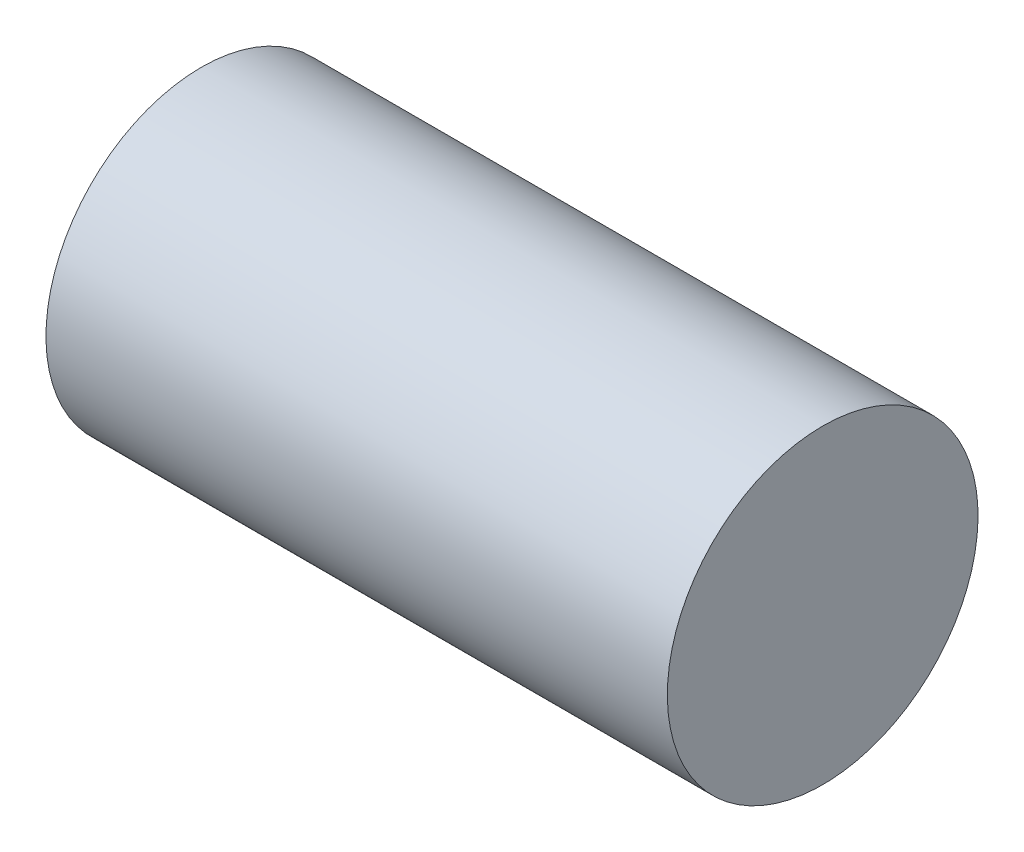
ISO-10303-21;
HEADER;
FILE_DESCRIPTION(('STEP AP214'),'2;1');
FILE_NAME('part.step','',(''),(''),'','','');
FILE_SCHEMA(('AUTOMOTIVE_DESIGN { 1 0 10303 214 1 1 1 1 }'));
ENDSEC;
DATA;
#1=APPLICATION_CONTEXT('core data for automotive mechanical design processes');
#2=APPLICATION_PROTOCOL_DEFINITION('international standard','automotive_design',2000,#1);
#3=PRODUCT_CONTEXT('',#1,'mechanical');
#4=PRODUCT('Part','Part','',(#3));
#5=PRODUCT_RELATED_PRODUCT_CATEGORY('part','',(#4));
#6=PRODUCT_DEFINITION_FORMATION('','',#4);
#7=PRODUCT_DEFINITION_CONTEXT('part definition',#1,'design');
#8=PRODUCT_DEFINITION('design','',#6,#7);
#9=PRODUCT_DEFINITION_SHAPE('','',#8);
#10=(LENGTH_UNIT() NAMED_UNIT(*) SI_UNIT(.MILLI.,.METRE.));
#11=(NAMED_UNIT(*) PLANE_ANGLE_UNIT() SI_UNIT($,.RADIAN.));
#12=(NAMED_UNIT(*) SI_UNIT($,.STERADIAN.) SOLID_ANGLE_UNIT());
#13=UNCERTAINTY_MEASURE_WITH_UNIT(LENGTH_MEASURE(1.E-05),#10,'distance_accuracy_value','');
#14=(GEOMETRIC_REPRESENTATION_CONTEXT(3) GLOBAL_UNCERTAINTY_ASSIGNED_CONTEXT((#13)) GLOBAL_UNIT_ASSIGNED_CONTEXT((#10,
#11,#12)) REPRESENTATION_CONTEXT('',''));
#15=CARTESIAN_POINT('',(0.,0.,0.));
#16=DIRECTION('',(0.,0.,1.));
#17=DIRECTION('',(1.,0.,0.));
#18=AXIS2_PLACEMENT_3D('',#15,#16,#17);
#19=CARTESIAN_POINT('',(0.,0.,0.));
#20=DIRECTION('',(1.,0.,0.));
#21=DIRECTION('',(0.,1.,0.));
#22=AXIS2_PLACEMENT_3D('',#19,#20,#21);
#23=PLANE('',#22);
#24=CARTESIAN_POINT('',(0.,0.,0.));
#25=DIRECTION('',(1.,0.,0.));
#26=DIRECTION('',(0.,1.,0.));
#27=AXIS2_PLACEMENT_3D('',#24,#25,#26);
#28=CIRCLE('',#27,1.);
#29=CARTESIAN_POINT('',(0.,1.,0.));
#30=VERTEX_POINT('',#29);
#31=EDGE_CURVE('E10',#30,#30,#28,.T.);
#32=ORIENTED_EDGE('',*,*,#31,.T.);
#33=EDGE_LOOP('',(#32));
#34=FACE_BOUND('',#33,.T.);
#35=ADVANCED_FACE('F35',(#34),#23,.T.);
#36=CARTESIAN_POINT('',(0.,0.,0.));
#37=DIRECTION('',(1.,0.,0.));
#38=DIRECTION('',(0.,1.,0.));
#39=AXIS2_PLACEMENT_3D('',#36,#37,#38);
#40=CYLINDRICAL_SURFACE('',#39,1.);
#41=CARTESIAN_POINT('',(-4.,0.,0.));
#42=DIRECTION('',(1.,0.,0.));
#43=DIRECTION('',(0.,1.,0.));
#44=AXIS2_PLACEMENT_3D('',#41,#42,#43);
#45=CIRCLE('',#44,1.);
#46=CARTESIAN_POINT('',(-4.,1.,0.));
#47=VERTEX_POINT('',#46);
#48=EDGE_CURVE('E41',#47,#47,#45,.T.);
#49=ORIENTED_EDGE('',*,*,#48,.T.);
#50=EDGE_LOOP('',(#49));
#51=FACE_BOUND('',#50,.T.);
#52=ORIENTED_EDGE('',*,*,#31,.F.);
#53=EDGE_LOOP('',(#52));
#54=FACE_BOUND('',#53,.T.);
#55=ADVANCED_FACE('F47',(#51,#54),#40,.T.);
#56=CARTESIAN_POINT('',(-4.,0.,0.));
#57=DIRECTION('',(-1.,0.,0.));
#58=DIRECTION('',(0.,-1.,0.));
#59=AXIS2_PLACEMENT_3D('',#56,#57,#58);
#60=PLANE('',#59);
#61=ORIENTED_EDGE('',*,*,#48,.F.);
#62=EDGE_LOOP('',(#61));
#63=FACE_BOUND('',#62,.T.);
#64=ADVANCED_FACE('F50',(#63),#60,.T.);
#65=CLOSED_SHELL('',(#35,#55,#64));
#66=MANIFOLD_SOLID_BREP('B2',#65);
#67=ADVANCED_BREP_SHAPE_REPRESENTATION('',(#18,#66),#14);
#68=SHAPE_DEFINITION_REPRESENTATION(#9,#67);
ENDSEC;
END-ISO-10303-21;
